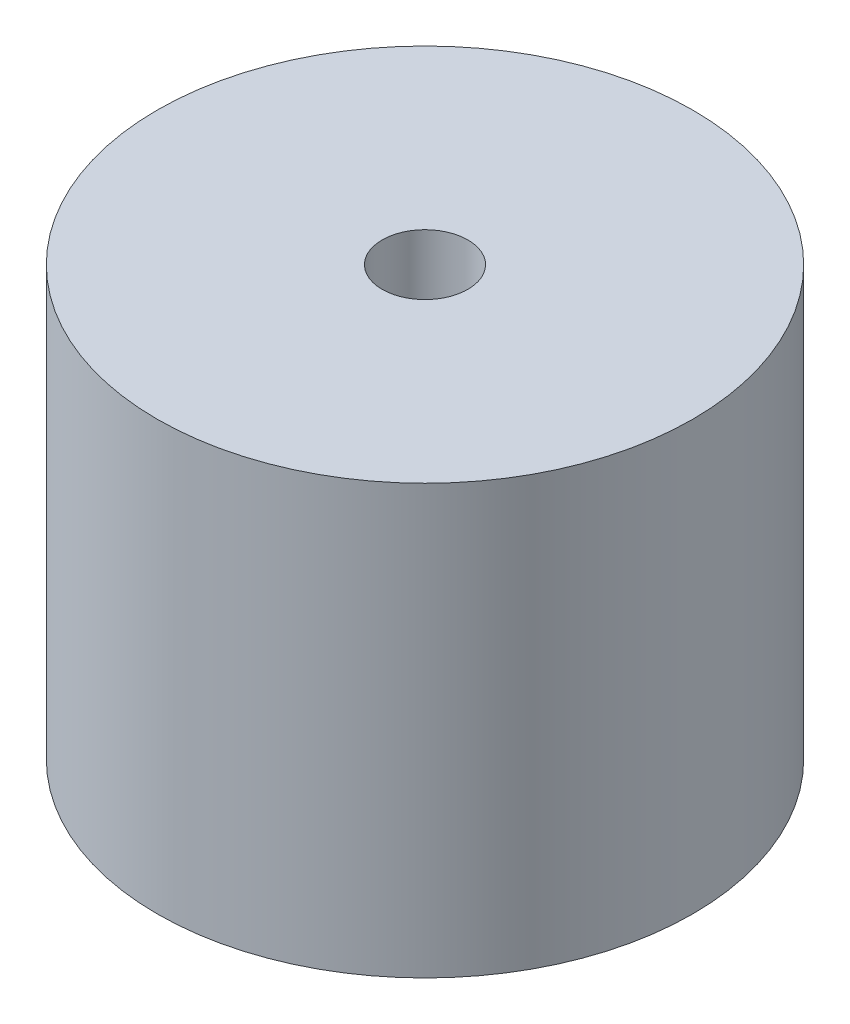
ISO-10303-21;
HEADER;
FILE_DESCRIPTION(('STEP AP214'),'2;1');
FILE_NAME('part.step','',(''),(''),'','','');
FILE_SCHEMA(('AUTOMOTIVE_DESIGN { 1 0 10303 214 1 1 1 1 }'));
ENDSEC;
DATA;
#1=APPLICATION_CONTEXT('core data for automotive mechanical design processes');
#2=APPLICATION_PROTOCOL_DEFINITION('international standard','automotive_design',2000,#1);
#3=PRODUCT_CONTEXT('',#1,'mechanical');
#4=PRODUCT('Part','Part','',(#3));
#5=PRODUCT_RELATED_PRODUCT_CATEGORY('part','',(#4));
#6=PRODUCT_DEFINITION_FORMATION('','',#4);
#7=PRODUCT_DEFINITION_CONTEXT('part definition',#1,'design');
#8=PRODUCT_DEFINITION('design','',#6,#7);
#9=PRODUCT_DEFINITION_SHAPE('','',#8);
#10=(LENGTH_UNIT() NAMED_UNIT(*) SI_UNIT(.MILLI.,.METRE.));
#11=(NAMED_UNIT(*) PLANE_ANGLE_UNIT() SI_UNIT($,.RADIAN.));
#12=(NAMED_UNIT(*) SI_UNIT($,.STERADIAN.) SOLID_ANGLE_UNIT());
#13=UNCERTAINTY_MEASURE_WITH_UNIT(LENGTH_MEASURE(1.E-05),#10,'distance_accuracy_value','');
#14=(GEOMETRIC_REPRESENTATION_CONTEXT(3) GLOBAL_UNCERTAINTY_ASSIGNED_CONTEXT((#13)) GLOBAL_UNIT_ASSIGNED_CONTEXT((#10,
#11,#12)) REPRESENTATION_CONTEXT('',''));
#15=CARTESIAN_POINT('',(0.,0.,0.));
#16=DIRECTION('',(0.,0.,1.));
#17=DIRECTION('',(1.,0.,0.));
#18=AXIS2_PLACEMENT_3D('',#15,#16,#17);
#19=CARTESIAN_POINT('',(0.,20.,0.));
#20=DIRECTION('',(0.,-1.,0.));
#21=DIRECTION('',(0.,0.,-1.));
#22=AXIS2_PLACEMENT_3D('',#19,#20,#21);
#23=CYLINDRICAL_SURFACE('',#22,12.5);
#24=CARTESIAN_POINT('',(0.,20.,0.));
#25=DIRECTION('',(0.,1.,0.));
#26=DIRECTION('',(0.,0.,1.));
#27=AXIS2_PLACEMENT_3D('',#24,#25,#26);
#28=CIRCLE('',#27,12.5);
#29=CARTESIAN_POINT('',(0.,20.,12.5));
#30=VERTEX_POINT('',#29);
#31=EDGE_CURVE('E10',#30,#30,#28,.T.);
#32=ORIENTED_EDGE('',*,*,#31,.F.);
#33=EDGE_LOOP('',(#32));
#34=FACE_BOUND('',#33,.T.);
#35=CARTESIAN_POINT('',(0.,0.,0.));
#36=DIRECTION('',(0.,1.,0.));
#37=DIRECTION('',(0.,0.,1.));
#38=AXIS2_PLACEMENT_3D('',#35,#36,#37);
#39=CIRCLE('',#38,12.5);
#40=CARTESIAN_POINT('',(0.,0.,12.5));
#41=VERTEX_POINT('',#40);
#42=EDGE_CURVE('E46',#41,#41,#39,.T.);
#43=ORIENTED_EDGE('',*,*,#42,.T.);
#44=EDGE_LOOP('',(#43));
#45=FACE_BOUND('',#44,.T.);
#46=ADVANCED_FACE('F43',(#34,#45),#23,.T.);
#47=CARTESIAN_POINT('',(0.,20.,0.));
#48=DIRECTION('',(0.,1.,0.));
#49=DIRECTION('',(0.,0.,1.));
#50=AXIS2_PLACEMENT_3D('',#47,#48,#49);
#51=PLANE('',#50);
#52=CARTESIAN_POINT('',(0.,20.,0.));
#53=DIRECTION('',(0.,1.,0.));
#54=DIRECTION('',(0.,0.,1.));
#55=AXIS2_PLACEMENT_3D('',#52,#53,#54);
#56=CIRCLE('',#55,2.);
#57=CARTESIAN_POINT('',(0.,20.,2.));
#58=VERTEX_POINT('',#57);
#59=EDGE_CURVE('E57',#58,#58,#56,.T.);
#60=ORIENTED_EDGE('',*,*,#59,.F.);
#61=EDGE_LOOP('',(#60));
#62=FACE_BOUND('',#61,.T.);
#63=ORIENTED_EDGE('',*,*,#31,.T.);
#64=EDGE_LOOP('',(#63));
#65=FACE_BOUND('',#64,.T.);
#66=ADVANCED_FACE('F74',(#62,#65),#51,.T.);
#67=CARTESIAN_POINT('',(0.,0.,0.));
#68=DIRECTION('',(0.,1.,0.));
#69=DIRECTION('',(0.,0.,1.));
#70=AXIS2_PLACEMENT_3D('',#67,#68,#69);
#71=PLANE('',#70);
#72=ORIENTED_EDGE('',*,*,#42,.F.);
#73=EDGE_LOOP('',(#72));
#74=FACE_BOUND('',#73,.T.);
#75=ADVANCED_FACE('F70',(#74),#71,.F.);
#76=CARTESIAN_POINT('',(0.,12.,0.));
#77=DIRECTION('',(0.,1.,0.));
#78=DIRECTION('',(0.,0.,1.));
#79=AXIS2_PLACEMENT_3D('',#76,#77,#78);
#80=CYLINDRICAL_SURFACE('',#79,2.);
#81=CARTESIAN_POINT('',(0.,12.,0.));
#82=DIRECTION('',(0.,1.,0.));
#83=DIRECTION('',(0.,0.,1.));
#84=AXIS2_PLACEMENT_3D('',#81,#82,#83);
#85=CIRCLE('',#84,2.);
#86=CARTESIAN_POINT('',(0.,12.,2.));
#87=VERTEX_POINT('',#86);
#88=EDGE_CURVE('E55',#87,#87,#85,.T.);
#89=ORIENTED_EDGE('',*,*,#88,.F.);
#90=EDGE_LOOP('',(#89));
#91=FACE_BOUND('',#90,.T.);
#92=ORIENTED_EDGE('',*,*,#59,.T.);
#93=EDGE_LOOP('',(#92));
#94=FACE_BOUND('',#93,.T.);
#95=ADVANCED_FACE('F67',(#91,#94),#80,.F.);
#96=CARTESIAN_POINT('',(0.,12.,0.));
#97=DIRECTION('',(0.,1.,0.));
#98=DIRECTION('',(0.,0.,1.));
#99=AXIS2_PLACEMENT_3D('',#96,#97,#98);
#100=PLANE('',#99);
#101=ORIENTED_EDGE('',*,*,#88,.T.);
#102=EDGE_LOOP('',(#101));
#103=FACE_BOUND('',#102,.T.);
#104=ADVANCED_FACE('F65',(#103),#100,.T.);
#105=CLOSED_SHELL('',(#46,#66,#75,#95,#104));
#106=MANIFOLD_SOLID_BREP('B2',#105);
#107=ADVANCED_BREP_SHAPE_REPRESENTATION('',(#18,#106),#14);
#108=SHAPE_DEFINITION_REPRESENTATION(#9,#107);
ENDSEC;
END-ISO-10303-21;
